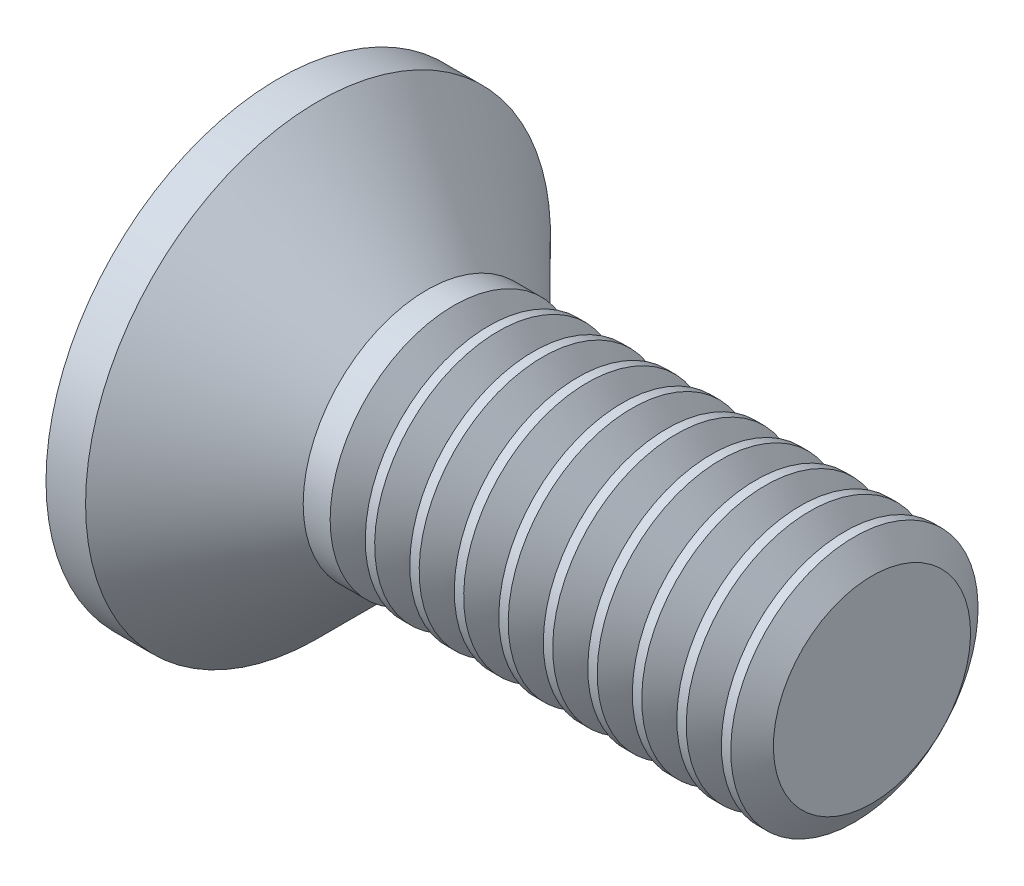
ISO-10303-21;
HEADER;
FILE_DESCRIPTION(('STEP AP214'),'2;1');
FILE_NAME('part.step','',(''),(''),'','','');
FILE_SCHEMA(('AUTOMOTIVE_DESIGN { 1 0 10303 214 1 1 1 1 }'));
ENDSEC;
DATA;
#1=APPLICATION_CONTEXT('core data for automotive mechanical design processes');
#2=APPLICATION_PROTOCOL_DEFINITION('international standard','automotive_design',2000,#1);
#3=PRODUCT_CONTEXT('',#1,'mechanical');
#4=PRODUCT('Part','Part','',(#3));
#5=PRODUCT_RELATED_PRODUCT_CATEGORY('part','',(#4));
#6=PRODUCT_DEFINITION_FORMATION('','',#4);
#7=PRODUCT_DEFINITION_CONTEXT('part definition',#1,'design');
#8=PRODUCT_DEFINITION('design','',#6,#7);
#9=PRODUCT_DEFINITION_SHAPE('','',#8);
#10=(LENGTH_UNIT() NAMED_UNIT(*) SI_UNIT(.MILLI.,.METRE.));
#11=(NAMED_UNIT(*) PLANE_ANGLE_UNIT() SI_UNIT($,.RADIAN.));
#12=(NAMED_UNIT(*) SI_UNIT($,.STERADIAN.) SOLID_ANGLE_UNIT());
#13=UNCERTAINTY_MEASURE_WITH_UNIT(LENGTH_MEASURE(1.E-05),#10,'distance_accuracy_value','');
#14=(GEOMETRIC_REPRESENTATION_CONTEXT(3) GLOBAL_UNCERTAINTY_ASSIGNED_CONTEXT((#13)) GLOBAL_UNIT_ASSIGNED_CONTEXT((#10,
#11,#12)) REPRESENTATION_CONTEXT('',''));
#15=CARTESIAN_POINT('',(0.,0.,0.));
#16=DIRECTION('',(0.,0.,1.));
#17=DIRECTION('',(1.,0.,0.));
#18=AXIS2_PLACEMENT_3D('',#15,#16,#17);
#19=CARTESIAN_POINT('',(0.,0.,0.));
#20=DIRECTION('',(-1.,0.,0.));
#21=DIRECTION('',(0.,0.,1.));
#22=AXIS2_PLACEMENT_3D('',#19,#20,#21);
#23=PLANE('',#22);
#24=CARTESIAN_POINT('',(0.,0.,0.));
#25=DIRECTION('',(-1.,0.,0.));
#26=DIRECTION('',(0.,0.,1.));
#27=AXIS2_PLACEMENT_3D('',#24,#25,#26);
#28=CIRCLE('',#27,2.35);
#29=CARTESIAN_POINT('',(0.,0.,2.35));
#30=VERTEX_POINT('',#29);
#31=EDGE_CURVE('E41',#30,#30,#28,.T.);
#32=ORIENTED_EDGE('',*,*,#31,.T.);
#33=EDGE_LOOP('',(#32));
#34=FACE_BOUND('',#33,.T.);
#35=DIRECTION('',(0.,1.,0.));
#36=VECTOR('',#35,1.);
#37=CARTESIAN_POINT('',(0.,-1.4,-0.37));
#38=LINE('',#37,#36);
#39=CARTESIAN_POINT('',(0.,-1.4,-0.37));
#40=VERTEX_POINT('',#39);
#41=CARTESIAN_POINT('',(0.,-0.369999999999999,-0.37));
#42=VERTEX_POINT('',#41);
#43=EDGE_CURVE('E102',#40,#42,#38,.T.);
#44=ORIENTED_EDGE('',*,*,#43,.T.);
#45=DIRECTION('',(0.,0.,-1.));
#46=VECTOR('',#45,1.);
#47=CARTESIAN_POINT('',(0.,-0.370000000000005,1.4));
#48=LINE('',#47,#46);
#49=CARTESIAN_POINT('',(0.,-0.369999999999995,-1.4));
#50=VERTEX_POINT('',#49);
#51=EDGE_CURVE('E82',#42,#50,#48,.T.);
#52=ORIENTED_EDGE('',*,*,#51,.T.);
#53=DIRECTION('',(0.,1.,0.));
#54=VECTOR('',#53,1.);
#55=CARTESIAN_POINT('',(0.,-0.369999999999995,-1.4));
#56=LINE('',#55,#54);
#57=CARTESIAN_POINT('',(0.,0.370000000000005,-1.4));
#58=VERTEX_POINT('',#57);
#59=EDGE_CURVE('E387',#50,#58,#56,.T.);
#60=ORIENTED_EDGE('',*,*,#59,.T.);
#61=DIRECTION('',(0.,0.,1.));
#62=VECTOR('',#61,1.);
#63=CARTESIAN_POINT('',(0.,0.370000000000005,-1.4));
#64=LINE('',#63,#62);
#65=CARTESIAN_POINT('',(0.,0.370000000000001,-0.37));
#66=VERTEX_POINT('',#65);
#67=EDGE_CURVE('E98',#58,#66,#64,.T.);
#68=ORIENTED_EDGE('',*,*,#67,.T.);
#69=CARTESIAN_POINT('',(0.,1.4,-0.37));
#70=VERTEX_POINT('',#69);
#71=EDGE_CURVE('E92',#66,#70,#38,.T.);
#72=ORIENTED_EDGE('',*,*,#71,.T.);
#73=DIRECTION('',(0.,0.,1.));
#74=VECTOR('',#73,1.);
#75=CARTESIAN_POINT('',(0.,1.4,-0.37));
#76=LINE('',#75,#74);
#77=CARTESIAN_POINT('',(0.,1.4,0.37));
#78=VERTEX_POINT('',#77);
#79=EDGE_CURVE('E95',#70,#78,#76,.T.);
#80=ORIENTED_EDGE('',*,*,#79,.T.);
#81=DIRECTION('',(0.,-1.,0.));
#82=VECTOR('',#81,1.);
#83=CARTESIAN_POINT('',(0.,1.4,0.37));
#84=LINE('',#83,#82);
#85=CARTESIAN_POINT('',(0.,0.369999999999998,0.37));
#86=VERTEX_POINT('',#85);
#87=EDGE_CURVE('E405',#78,#86,#84,.T.);
#88=ORIENTED_EDGE('',*,*,#87,.T.);
#89=CARTESIAN_POINT('',(0.,0.369999999999995,1.4));
#90=VERTEX_POINT('',#89);
#91=EDGE_CURVE('E390',#86,#90,#64,.T.);
#92=ORIENTED_EDGE('',*,*,#91,.T.);
#93=DIRECTION('',(0.,-1.,0.));
#94=VECTOR('',#93,1.);
#95=CARTESIAN_POINT('',(0.,0.369999999999995,1.4));
#96=LINE('',#95,#94);
#97=CARTESIAN_POINT('',(0.,-0.370000000000005,1.4));
#98=VERTEX_POINT('',#97);
#99=EDGE_CURVE('E381',#90,#98,#96,.T.);
#100=ORIENTED_EDGE('',*,*,#99,.T.);
#101=CARTESIAN_POINT('',(0.,-0.370000000000001,0.37));
#102=VERTEX_POINT('',#101);
#103=EDGE_CURVE('E384',#98,#102,#48,.T.);
#104=ORIENTED_EDGE('',*,*,#103,.T.);
#105=CARTESIAN_POINT('',(0.,-1.4,0.37));
#106=VERTEX_POINT('',#105);
#107=EDGE_CURVE('E108',#102,#106,#84,.T.);
#108=ORIENTED_EDGE('',*,*,#107,.T.);
#109=DIRECTION('',(0.,0.,-1.));
#110=VECTOR('',#109,1.);
#111=CARTESIAN_POINT('',(0.,-1.4,0.37));
#112=LINE('',#111,#110);
#113=EDGE_CURVE('E131',#106,#40,#112,.T.);
#114=ORIENTED_EDGE('',*,*,#113,.T.);
#115=EDGE_LOOP('',(#44,#52,#60,#68,#72,#80,#88,#92,#100,#104,#108,#114));
#116=FACE_BOUND('',#115,.T.);
#117=ADVANCED_FACE('F34',(#34,#116),#23,.T.);
#118=CARTESIAN_POINT('',(2.05102880658436,0.,0.156831275720165));
#119=DIRECTION('',(-0.103375752440195,0.,-0.994642374829981));
#120=DIRECTION('',(-0.994642374829981,0.,0.103375752440195));
#121=AXIS2_PLACEMENT_3D('',#118,#119,#120);
#122=PLANE('',#121);
#123=ORIENTED_EDGE('',*,*,#107,.F.);
#124=DIRECTION('',(0.989369949567276,0.102827775657273,-0.102827775657273));
#125=VECTOR('',#124,1.);
#126=CARTESIAN_POINT('',(2.06698399112941,-0.155173012157898,0.155173012157898));
#127=LINE('',#126,#125);
#128=CARTESIAN_POINT('',(1.78,-0.185000000000001,0.184999999999999));
#129=VERTEX_POINT('',#128);
#130=EDGE_CURVE('E126',#102,#129,#127,.T.);
#131=ORIENTED_EDGE('',*,*,#130,.T.);
#132=DIRECTION('',(0.822906402232494,0.561702965568809,-0.0855267889960739));
#133=VECTOR('',#132,1.);
#134=CARTESIAN_POINT('',(0.,-1.4,0.37));
#135=LINE('',#134,#133);
#136=EDGE_CURVE('E103',#106,#129,#135,.T.);
#137=ORIENTED_EDGE('',*,*,#136,.F.);
#138=EDGE_LOOP('',(#123,#131,#137));
#139=FACE_BOUND('',#138,.T.);
#140=ADVANCED_FACE('F151',(#139),#122,.T.);
#141=DIRECTION('',(0.822906402232494,-0.561702965568809,-0.0855267889960737));
#142=VECTOR('',#141,1.);
#143=CARTESIAN_POINT('',(0.,1.4,0.37));
#144=LINE('',#143,#142);
#145=CARTESIAN_POINT('',(1.78,0.185,0.185));
#146=VERTEX_POINT('',#145);
#147=EDGE_CURVE('E48',#78,#146,#144,.T.);
#148=ORIENTED_EDGE('',*,*,#147,.T.);
#149=DIRECTION('',(-0.989369949567276,0.102827775657273,0.102827775657273));
#150=VECTOR('',#149,1.);
#151=CARTESIAN_POINT('',(2.06698399112941,0.155173012157897,0.155173012157898));
#152=LINE('',#151,#150);
#153=EDGE_CURVE('E400',#146,#86,#152,.T.);
#154=ORIENTED_EDGE('',*,*,#153,.T.);
#155=ORIENTED_EDGE('',*,*,#87,.F.);
#156=EDGE_LOOP('',(#148,#154,#155));
#157=FACE_BOUND('',#156,.T.);
#158=ADVANCED_FACE('F155',(#157),#122,.T.);
#159=CARTESIAN_POINT('',(2.05102880658436,0.,-0.156831275720165));
#160=DIRECTION('',(-0.103375752440194,0.,0.994642374829981));
#161=DIRECTION('',(0.994642374829981,0.,0.103375752440194));
#162=AXIS2_PLACEMENT_3D('',#159,#160,#161);
#163=PLANE('',#162);
#164=DIRECTION('',(0.822906402232494,0.561702965568809,0.0855267889960737));
#165=VECTOR('',#164,1.);
#166=CARTESIAN_POINT('',(0.,-1.4,-0.37));
#167=LINE('',#166,#165);
#168=CARTESIAN_POINT('',(1.78,-0.184999999999999,-0.185000000000001));
#169=VERTEX_POINT('',#168);
#170=EDGE_CURVE('E57',#40,#169,#167,.T.);
#171=ORIENTED_EDGE('',*,*,#170,.T.);
#172=DIRECTION('',(-0.989369949567276,-0.102827775657273,-0.102827775657273));
#173=VECTOR('',#172,1.);
#174=CARTESIAN_POINT('',(2.06698399112941,-0.155173012157897,-0.155173012157898));
#175=LINE('',#174,#173);
#176=EDGE_CURVE('E11',#169,#42,#175,.T.);
#177=ORIENTED_EDGE('',*,*,#176,.T.);
#178=ORIENTED_EDGE('',*,*,#43,.F.);
#179=EDGE_LOOP('',(#171,#177,#178));
#180=FACE_BOUND('',#179,.T.);
#181=ADVANCED_FACE('F148',(#180),#163,.T.);
#182=ORIENTED_EDGE('',*,*,#71,.F.);
#183=DIRECTION('',(0.989369949567276,-0.102827775657273,0.102827775657273));
#184=VECTOR('',#183,1.);
#185=CARTESIAN_POINT('',(2.06698399112941,0.155173012157898,-0.155173012157898));
#186=LINE('',#185,#184);
#187=CARTESIAN_POINT('',(1.78,0.185,-0.185));
#188=VERTEX_POINT('',#187);
#189=EDGE_CURVE('E111',#66,#188,#186,.T.);
#190=ORIENTED_EDGE('',*,*,#189,.T.);
#191=DIRECTION('',(0.822906402232494,-0.561702965568809,0.0855267889960737));
#192=VECTOR('',#191,1.);
#193=CARTESIAN_POINT('',(0.,1.4,-0.37));
#194=LINE('',#193,#192);
#195=EDGE_CURVE('E107',#70,#188,#194,.T.);
#196=ORIENTED_EDGE('',*,*,#195,.F.);
#197=EDGE_LOOP('',(#182,#190,#196));
#198=FACE_BOUND('',#197,.T.);
#199=ADVANCED_FACE('F110',(#198),#163,.T.);
#200=CARTESIAN_POINT('',(-6.34999999999999,0.,0.));
#201=DIRECTION('',(-1.,0.,0.));
#202=DIRECTION('',(0.,0.,1.));
#203=AXIS2_PLACEMENT_3D('',#200,#201,#202);
#204=CYLINDRICAL_SURFACE('',#203,2.35);
#205=CARTESIAN_POINT('',(0.400000000000005,0.,0.));
#206=DIRECTION('',(-1.,0.,0.));
#207=DIRECTION('',(0.,0.,1.));
#208=AXIS2_PLACEMENT_3D('',#205,#206,#207);
#209=CIRCLE('',#208,2.35);
#210=CARTESIAN_POINT('',(0.400000000000005,0.,2.35));
#211=VERTEX_POINT('',#210);
#212=EDGE_CURVE('E130',#211,#211,#209,.T.);
#213=ORIENTED_EDGE('',*,*,#212,.T.);
#214=EDGE_LOOP('',(#213));
#215=FACE_BOUND('',#214,.T.);
#216=ORIENTED_EDGE('',*,*,#31,.F.);
#217=EDGE_LOOP('',(#216));
#218=FACE_BOUND('',#217,.T.);
#219=ADVANCED_FACE('F137',(#215,#218),#204,.T.);
#220=CARTESIAN_POINT('',(0.400000000000005,0.,0.));
#221=DIRECTION('',(-1.,0.,0.));
#222=DIRECTION('',(0.,0.,1.));
#223=AXIS2_PLACEMENT_3D('',#220,#221,#222);
#224=CONICAL_SURFACE('',#223,2.35,0.78539816339745);
#225=CARTESIAN_POINT('',(1.5,0.,0.));
#226=DIRECTION('',(-1.,0.,0.));
#227=DIRECTION('',(0.,0.,1.));
#228=AXIS2_PLACEMENT_3D('',#225,#226,#227);
#229=CIRCLE('',#228,1.25);
#230=CARTESIAN_POINT('',(1.5,0.,1.25));
#231=VERTEX_POINT('',#230);
#232=EDGE_CURVE('E127',#231,#231,#229,.T.);
#233=ORIENTED_EDGE('',*,*,#232,.T.);
#234=EDGE_LOOP('',(#233));
#235=FACE_BOUND('',#234,.T.);
#236=ORIENTED_EDGE('',*,*,#212,.F.);
#237=EDGE_LOOP('',(#236));
#238=FACE_BOUND('',#237,.T.);
#239=ADVANCED_FACE('F139',(#235,#238),#224,.T.);
#240=CARTESIAN_POINT('',(-6.34999999999999,0.,0.));
#241=DIRECTION('',(-1.,0.,0.));
#242=DIRECTION('',(0.,0.,1.));
#243=AXIS2_PLACEMENT_3D('',#240,#241,#242);
#244=CYLINDRICAL_SURFACE('',#243,1.25);
#245=CARTESIAN_POINT('',(1.77249838906384,0.,0.));
#246=DIRECTION('',(-1.,0.,0.));
#247=DIRECTION('',(0.,-1.,0.));
#248=AXIS2_PLACEMENT_3D('',#245,#246,#247);
#249=CIRCLE('',#248,1.25);
#250=CARTESIAN_POINT('',(1.77249838906384,-1.25,0.));
#251=VERTEX_POINT('',#250);
#252=EDGE_CURVE('E375',#251,#251,#249,.T.);
#253=ORIENTED_EDGE('',*,*,#252,.T.);
#254=EDGE_LOOP('',(#253));
#255=FACE_BOUND('',#254,.T.);
#256=ORIENTED_EDGE('',*,*,#232,.F.);
#257=EDGE_LOOP('',(#256));
#258=FACE_BOUND('',#257,.T.);
#259=ADVANCED_FACE('F145',(#255,#258),#244,.T.);
#260=CARTESIAN_POINT('',(1.78,0.185,-0.185));
#261=DIRECTION('',(1.,0.,0.));
#262=DIRECTION('',(0.,0.,-1.));
#263=AXIS2_PLACEMENT_3D('',#260,#261,#262);
#264=PLANE('',#263);
#265=DIRECTION('',(0.,1.,0.));
#266=VECTOR('',#265,1.);
#267=CARTESIAN_POINT('',(1.78,-0.185,-0.185));
#268=LINE('',#267,#266);
#269=EDGE_CURVE('E122',#169,#188,#268,.T.);
#270=ORIENTED_EDGE('',*,*,#269,.F.);
#271=DIRECTION('',(0.,0.,-1.));
#272=VECTOR('',#271,1.);
#273=CARTESIAN_POINT('',(1.78,-0.185,0.185));
#274=LINE('',#273,#272);
#275=EDGE_CURVE('E113',#129,#169,#274,.T.);
#276=ORIENTED_EDGE('',*,*,#275,.F.);
#277=DIRECTION('',(0.,-1.,0.));
#278=VECTOR('',#277,1.);
#279=CARTESIAN_POINT('',(1.78,0.185,0.185));
#280=LINE('',#279,#278);
#281=EDGE_CURVE('E116',#146,#129,#280,.T.);
#282=ORIENTED_EDGE('',*,*,#281,.F.);
#283=DIRECTION('',(0.,0.,1.));
#284=VECTOR('',#283,1.);
#285=CARTESIAN_POINT('',(1.78,0.185,-0.185));
#286=LINE('',#285,#284);
#287=EDGE_CURVE('E120',#188,#146,#286,.T.);
#288=ORIENTED_EDGE('',*,*,#287,.F.);
#289=EDGE_LOOP('',(#270,#276,#282,#288));
#290=FACE_BOUND('',#289,.T.);
#291=ADVANCED_FACE('F172',(#290),#264,.F.);
#292=CARTESIAN_POINT('',(0.,-1.4,-0.37));
#293=DIRECTION('',(-0.563768686614845,0.825932726069486,0.));
#294=DIRECTION('',(-0.825932726069486,-0.563768686614845,0.));
#295=AXIS2_PLACEMENT_3D('',#292,#293,#294);
#296=PLANE('',#295);
#297=ORIENTED_EDGE('',*,*,#170,.F.);
#298=ORIENTED_EDGE('',*,*,#113,.F.);
#299=ORIENTED_EDGE('',*,*,#136,.T.);
#300=ORIENTED_EDGE('',*,*,#275,.T.);
#301=EDGE_LOOP('',(#297,#298,#299,#300));
#302=FACE_BOUND('',#301,.T.);
#303=ADVANCED_FACE('F164',(#302),#296,.T.);
#304=CARTESIAN_POINT('',(0.,1.4,0.37));
#305=DIRECTION('',(-0.563768686614845,-0.825932726069486,0.));
#306=DIRECTION('',(0.825932726069486,-0.563768686614845,0.));
#307=AXIS2_PLACEMENT_3D('',#304,#305,#306);
#308=PLANE('',#307);
#309=ORIENTED_EDGE('',*,*,#147,.F.);
#310=ORIENTED_EDGE('',*,*,#79,.F.);
#311=ORIENTED_EDGE('',*,*,#195,.T.);
#312=ORIENTED_EDGE('',*,*,#287,.T.);
#313=EDGE_LOOP('',(#309,#310,#311,#312));
#314=FACE_BOUND('',#313,.T.);
#315=ADVANCED_FACE('F106',(#314),#308,.T.);
#316=CARTESIAN_POINT('',(2.05102880658436,-0.156831275720165,0.));
#317=DIRECTION('',(-0.103375752440195,0.994642374829981,0.));
#318=DIRECTION('',(-0.994642374829981,-0.103375752440195,0.));
#319=AXIS2_PLACEMENT_3D('',#316,#317,#318);
#320=PLANE('',#319);
#321=DIRECTION('',(0.822906402232494,0.0855267889960719,0.561702965568809));
#322=VECTOR('',#321,1.);
#323=CARTESIAN_POINT('',(0.,-0.369999999999995,-1.4));
#324=LINE('',#323,#322);
#325=EDGE_CURVE('E391',#50,#169,#324,.T.);
#326=ORIENTED_EDGE('',*,*,#325,.F.);
#327=ORIENTED_EDGE('',*,*,#51,.F.);
#328=ORIENTED_EDGE('',*,*,#176,.F.);
#329=EDGE_LOOP('',(#326,#327,#328));
#330=FACE_BOUND('',#329,.T.);
#331=ADVANCED_FACE('F171',(#330),#320,.T.);
#332=CARTESIAN_POINT('',(2.05102880658436,0.156831275720165,0.));
#333=DIRECTION('',(-0.103375752440194,-0.994642374829981,0.));
#334=DIRECTION('',(0.994642374829981,-0.103375752440194,0.));
#335=AXIS2_PLACEMENT_3D('',#332,#333,#334);
#336=PLANE('',#335);
#337=ORIENTED_EDGE('',*,*,#67,.F.);
#338=DIRECTION('',(0.822906402232494,-0.0855267889960756,0.561702965568808));
#339=VECTOR('',#338,1.);
#340=CARTESIAN_POINT('',(0.,0.370000000000005,-1.4));
#341=LINE('',#340,#339);
#342=EDGE_CURVE('E73',#58,#188,#341,.T.);
#343=ORIENTED_EDGE('',*,*,#342,.T.);
#344=ORIENTED_EDGE('',*,*,#189,.F.);
#345=EDGE_LOOP('',(#337,#343,#344));
#346=FACE_BOUND('',#345,.T.);
#347=ADVANCED_FACE('F443',(#346),#336,.T.);
#348=CARTESIAN_POINT('',(0.,0.370000000000005,-1.4));
#349=DIRECTION('',(-0.563768686614845,0.,0.825932726069486));
#350=DIRECTION('',(-0.825932726069486,0.,-0.563768686614845));
#351=AXIS2_PLACEMENT_3D('',#348,#349,#350);
#352=PLANE('',#351);
#353=ORIENTED_EDGE('',*,*,#342,.F.);
#354=ORIENTED_EDGE('',*,*,#59,.F.);
#355=ORIENTED_EDGE('',*,*,#325,.T.);
#356=ORIENTED_EDGE('',*,*,#269,.T.);
#357=EDGE_LOOP('',(#353,#354,#355,#356));
#358=FACE_BOUND('',#357,.T.);
#359=ADVANCED_FACE('F442',(#358),#352,.T.);
#360=ORIENTED_EDGE('',*,*,#103,.F.);
#361=DIRECTION('',(0.822906402232494,0.0855267889960757,-0.561702965568808));
#362=VECTOR('',#361,1.);
#363=CARTESIAN_POINT('',(0.,-0.370000000000005,1.4));
#364=LINE('',#363,#362);
#365=EDGE_CURVE('E395',#98,#129,#364,.T.);
#366=ORIENTED_EDGE('',*,*,#365,.T.);
#367=ORIENTED_EDGE('',*,*,#130,.F.);
#368=EDGE_LOOP('',(#360,#366,#367));
#369=FACE_BOUND('',#368,.T.);
#370=ADVANCED_FACE('F435',(#369),#320,.T.);
#371=DIRECTION('',(0.822906402232494,-0.0855267889960717,-0.561702965568809));
#372=VECTOR('',#371,1.);
#373=CARTESIAN_POINT('',(0.,0.369999999999995,1.4));
#374=LINE('',#373,#372);
#375=EDGE_CURVE('E380',#90,#146,#374,.T.);
#376=ORIENTED_EDGE('',*,*,#375,.F.);
#377=ORIENTED_EDGE('',*,*,#91,.F.);
#378=ORIENTED_EDGE('',*,*,#153,.F.);
#379=EDGE_LOOP('',(#376,#377,#378));
#380=FACE_BOUND('',#379,.T.);
#381=ADVANCED_FACE('F423',(#380),#336,.T.);
#382=CARTESIAN_POINT('',(0.,-0.370000000000005,1.4));
#383=DIRECTION('',(-0.563768686614845,0.,-0.825932726069486));
#384=DIRECTION('',(0.825932726069486,0.,-0.563768686614845));
#385=AXIS2_PLACEMENT_3D('',#382,#383,#384);
#386=PLANE('',#385);
#387=ORIENTED_EDGE('',*,*,#365,.F.);
#388=ORIENTED_EDGE('',*,*,#99,.F.);
#389=ORIENTED_EDGE('',*,*,#375,.T.);
#390=ORIENTED_EDGE('',*,*,#281,.T.);
#391=EDGE_LOOP('',(#387,#388,#389,#390));
#392=FACE_BOUND('',#391,.T.);
#393=ADVANCED_FACE('F429',(#392),#386,.T.);
#394=CARTESIAN_POINT('',(2.12750361093616,0.,0.));
#395=DIRECTION('',(1.,0.,0.));
#396=DIRECTION('',(0.,1.,0.));
#397=AXIS2_PLACEMENT_3D('',#394,#395,#396);
#398=CONICAL_SURFACE('',#397,1.25,0.959931088596883);
#399=CARTESIAN_POINT('',(1.950001,0.,0.));
#400=DIRECTION('',(-1.,0.,0.));
#401=DIRECTION('',(0.,-1.,0.));
#402=AXIS2_PLACEMENT_3D('',#399,#400,#401);
#403=CIRCLE('',#402,0.996500000000001);
#404=CARTESIAN_POINT('',(1.950001,-0.9965,0.));
#405=VERTEX_POINT('',#404);
#406=EDGE_CURVE('E372',#405,#405,#403,.T.);
#407=ORIENTED_EDGE('',*,*,#406,.F.);
#408=EDGE_LOOP('',(#407));
#409=FACE_BOUND('',#408,.T.);
#410=CARTESIAN_POINT('',(2.12750361093616,0.,0.));
#411=DIRECTION('',(-1.,0.,0.));
#412=DIRECTION('',(0.,-1.,0.));
#413=AXIS2_PLACEMENT_3D('',#410,#411,#412);
#414=CIRCLE('',#413,1.25);
#415=CARTESIAN_POINT('',(2.12750361093616,-1.25,0.));
#416=VERTEX_POINT('',#415);
#417=EDGE_CURVE('E377',#416,#416,#414,.T.);
#418=ORIENTED_EDGE('',*,*,#417,.T.);
#419=EDGE_LOOP('',(#418));
#420=FACE_BOUND('',#419,.T.);
#421=ADVANCED_FACE('F205',(#409,#420),#398,.T.);
#422=CARTESIAN_POINT('',(1.950001,0.,0.));
#423=DIRECTION('',(-1.,0.,0.));
#424=DIRECTION('',(0.,-1.,0.));
#425=AXIS2_PLACEMENT_3D('',#422,#423,#424);
#426=CONICAL_SURFACE('',#425,0.996500000000001,0.959931088596876);
#427=ORIENTED_EDGE('',*,*,#252,.F.);
#428=EDGE_LOOP('',(#427));
#429=FACE_BOUND('',#428,.T.);
#430=ORIENTED_EDGE('',*,*,#406,.T.);
#431=EDGE_LOOP('',(#430));
#432=FACE_BOUND('',#431,.T.);
#433=ADVANCED_FACE('F195',(#429,#432),#426,.T.);
#434=CARTESIAN_POINT('',(2.22249838906384,0.,0.));
#435=DIRECTION('',(-1.,0.,0.));
#436=DIRECTION('',(0.,-1.,0.));
#437=AXIS2_PLACEMENT_3D('',#434,#435,#436);
#438=CIRCLE('',#437,1.25);
#439=CARTESIAN_POINT('',(2.22249838906384,-1.25,0.));
#440=VERTEX_POINT('',#439);
#441=EDGE_CURVE('E367',#440,#440,#438,.T.);
#442=ORIENTED_EDGE('',*,*,#441,.T.);
#443=EDGE_LOOP('',(#442));
#444=FACE_BOUND('',#443,.T.);
#445=ORIENTED_EDGE('',*,*,#417,.F.);
#446=EDGE_LOOP('',(#445));
#447=FACE_BOUND('',#446,.T.);
#448=ADVANCED_FACE('F184',(#444,#447),#244,.T.);
#449=CARTESIAN_POINT('',(2.57750361093616,0.,0.));
#450=DIRECTION('',(1.,0.,0.));
#451=DIRECTION('',(0.,1.,0.));
#452=AXIS2_PLACEMENT_3D('',#449,#450,#451);
#453=CONICAL_SURFACE('',#452,1.25,0.959931088596883);
#454=CARTESIAN_POINT('',(2.400001,0.,0.));
#455=DIRECTION('',(-1.,0.,0.));
#456=DIRECTION('',(0.,-1.,0.));
#457=AXIS2_PLACEMENT_3D('',#454,#455,#456);
#458=CIRCLE('',#457,0.996500000000001);
#459=CARTESIAN_POINT('',(2.400001,-0.9965,0.));
#460=VERTEX_POINT('',#459);
#461=EDGE_CURVE('E364',#460,#460,#458,.T.);
#462=ORIENTED_EDGE('',*,*,#461,.F.);
#463=EDGE_LOOP('',(#462));
#464=FACE_BOUND('',#463,.T.);
#465=CARTESIAN_POINT('',(2.57750361093616,0.,0.));
#466=DIRECTION('',(-1.,0.,0.));
#467=DIRECTION('',(0.,-1.,0.));
#468=AXIS2_PLACEMENT_3D('',#465,#466,#467);
#469=CIRCLE('',#468,1.25);
#470=CARTESIAN_POINT('',(2.57750361093616,-1.25,0.));
#471=VERTEX_POINT('',#470);
#472=EDGE_CURVE('E369',#471,#471,#469,.T.);
#473=ORIENTED_EDGE('',*,*,#472,.T.);
#474=EDGE_LOOP('',(#473));
#475=FACE_BOUND('',#474,.T.);
#476=ADVANCED_FACE('F194',(#464,#475),#453,.T.);
#477=CARTESIAN_POINT('',(2.400001,0.,0.));
#478=DIRECTION('',(-1.,0.,0.));
#479=DIRECTION('',(0.,-1.,0.));
#480=AXIS2_PLACEMENT_3D('',#477,#478,#479);
#481=CONICAL_SURFACE('',#480,0.996500000000001,0.959931088596876);
#482=ORIENTED_EDGE('',*,*,#441,.F.);
#483=EDGE_LOOP('',(#482));
#484=FACE_BOUND('',#483,.T.);
#485=ORIENTED_EDGE('',*,*,#461,.T.);
#486=EDGE_LOOP('',(#485));
#487=FACE_BOUND('',#486,.T.);
#488=ADVANCED_FACE('F202',(#484,#487),#481,.T.);
#489=CARTESIAN_POINT('',(2.67249838906384,0.,0.));
#490=DIRECTION('',(-1.,0.,0.));
#491=DIRECTION('',(0.,-1.,0.));
#492=AXIS2_PLACEMENT_3D('',#489,#490,#491);
#493=CIRCLE('',#492,1.25);
#494=CARTESIAN_POINT('',(2.67249838906384,-1.25,0.));
#495=VERTEX_POINT('',#494);
#496=EDGE_CURVE('E359',#495,#495,#493,.T.);
#497=ORIENTED_EDGE('',*,*,#496,.T.);
#498=EDGE_LOOP('',(#497));
#499=FACE_BOUND('',#498,.T.);
#500=ORIENTED_EDGE('',*,*,#472,.F.);
#501=EDGE_LOOP('',(#500));
#502=FACE_BOUND('',#501,.T.);
#503=ADVANCED_FACE('F197',(#499,#502),#244,.T.);
#504=CARTESIAN_POINT('',(3.02750361093616,0.,0.));
#505=DIRECTION('',(1.,0.,0.));
#506=DIRECTION('',(0.,1.,0.));
#507=AXIS2_PLACEMENT_3D('',#504,#505,#506);
#508=CONICAL_SURFACE('',#507,1.25,0.959931088596883);
#509=CARTESIAN_POINT('',(2.850001,0.,0.));
#510=DIRECTION('',(-1.,0.,0.));
#511=DIRECTION('',(0.,-1.,0.));
#512=AXIS2_PLACEMENT_3D('',#509,#510,#511);
#513=CIRCLE('',#512,0.996500000000001);
#514=CARTESIAN_POINT('',(2.850001,-0.9965,0.));
#515=VERTEX_POINT('',#514);
#516=EDGE_CURVE('E356',#515,#515,#513,.T.);
#517=ORIENTED_EDGE('',*,*,#516,.F.);
#518=EDGE_LOOP('',(#517));
#519=FACE_BOUND('',#518,.T.);
#520=CARTESIAN_POINT('',(3.02750361093616,0.,0.));
#521=DIRECTION('',(-1.,0.,0.));
#522=DIRECTION('',(0.,-1.,0.));
#523=AXIS2_PLACEMENT_3D('',#520,#521,#522);
#524=CIRCLE('',#523,1.25);
#525=CARTESIAN_POINT('',(3.02750361093616,-1.25,0.));
#526=VERTEX_POINT('',#525);
#527=EDGE_CURVE('E361',#526,#526,#524,.T.);
#528=ORIENTED_EDGE('',*,*,#527,.T.);
#529=EDGE_LOOP('',(#528));
#530=FACE_BOUND('',#529,.T.);
#531=ADVANCED_FACE('F211',(#519,#530),#508,.T.);
#532=CARTESIAN_POINT('',(2.850001,0.,0.));
#533=DIRECTION('',(-1.,0.,0.));
#534=DIRECTION('',(0.,-1.,0.));
#535=AXIS2_PLACEMENT_3D('',#532,#533,#534);
#536=CONICAL_SURFACE('',#535,0.996500000000001,0.959931088596876);
#537=ORIENTED_EDGE('',*,*,#496,.F.);
#538=EDGE_LOOP('',(#537));
#539=FACE_BOUND('',#538,.T.);
#540=ORIENTED_EDGE('',*,*,#516,.T.);
#541=EDGE_LOOP('',(#540));
#542=FACE_BOUND('',#541,.T.);
#543=ADVANCED_FACE('F218',(#539,#542),#536,.T.);
#544=CARTESIAN_POINT('',(3.12249838906384,0.,0.));
#545=DIRECTION('',(-1.,0.,0.));
#546=DIRECTION('',(0.,-1.,0.));
#547=AXIS2_PLACEMENT_3D('',#544,#545,#546);
#548=CIRCLE('',#547,1.25);
#549=CARTESIAN_POINT('',(3.12249838906384,-1.25,0.));
#550=VERTEX_POINT('',#549);
#551=EDGE_CURVE('E351',#550,#550,#548,.T.);
#552=ORIENTED_EDGE('',*,*,#551,.T.);
#553=EDGE_LOOP('',(#552));
#554=FACE_BOUND('',#553,.T.);
#555=ORIENTED_EDGE('',*,*,#527,.F.);
#556=EDGE_LOOP('',(#555));
#557=FACE_BOUND('',#556,.T.);
#558=ADVANCED_FACE('F213',(#554,#557),#244,.T.);
#559=CARTESIAN_POINT('',(3.47750361093616,0.,0.));
#560=DIRECTION('',(1.,0.,0.));
#561=DIRECTION('',(0.,1.,0.));
#562=AXIS2_PLACEMENT_3D('',#559,#560,#561);
#563=CONICAL_SURFACE('',#562,1.25,0.959931088596883);
#564=CARTESIAN_POINT('',(3.300001,0.,0.));
#565=DIRECTION('',(-1.,0.,0.));
#566=DIRECTION('',(0.,-1.,0.));
#567=AXIS2_PLACEMENT_3D('',#564,#565,#566);
#568=CIRCLE('',#567,0.996500000000001);
#569=CARTESIAN_POINT('',(3.300001,-0.9965,0.));
#570=VERTEX_POINT('',#569);
#571=EDGE_CURVE('E348',#570,#570,#568,.T.);
#572=ORIENTED_EDGE('',*,*,#571,.F.);
#573=EDGE_LOOP('',(#572));
#574=FACE_BOUND('',#573,.T.);
#575=CARTESIAN_POINT('',(3.47750361093616,0.,0.));
#576=DIRECTION('',(-1.,0.,0.));
#577=DIRECTION('',(0.,-1.,0.));
#578=AXIS2_PLACEMENT_3D('',#575,#576,#577);
#579=CIRCLE('',#578,1.25);
#580=CARTESIAN_POINT('',(3.47750361093616,-1.25,0.));
#581=VERTEX_POINT('',#580);
#582=EDGE_CURVE('E353',#581,#581,#579,.T.);
#583=ORIENTED_EDGE('',*,*,#582,.T.);
#584=EDGE_LOOP('',(#583));
#585=FACE_BOUND('',#584,.T.);
#586=ADVANCED_FACE('F226',(#574,#585),#563,.T.);
#587=CARTESIAN_POINT('',(3.300001,0.,0.));
#588=DIRECTION('',(-1.,0.,0.));
#589=DIRECTION('',(0.,-1.,0.));
#590=AXIS2_PLACEMENT_3D('',#587,#588,#589);
#591=CONICAL_SURFACE('',#590,0.996500000000001,0.959931088596876);
#592=ORIENTED_EDGE('',*,*,#551,.F.);
#593=EDGE_LOOP('',(#592));
#594=FACE_BOUND('',#593,.T.);
#595=ORIENTED_EDGE('',*,*,#571,.T.);
#596=EDGE_LOOP('',(#595));
#597=FACE_BOUND('',#596,.T.);
#598=ADVANCED_FACE('F233',(#594,#597),#591,.T.);
#599=CARTESIAN_POINT('',(3.57249838906384,0.,0.));
#600=DIRECTION('',(-1.,0.,0.));
#601=DIRECTION('',(0.,-1.,0.));
#602=AXIS2_PLACEMENT_3D('',#599,#600,#601);
#603=CIRCLE('',#602,1.25);
#604=CARTESIAN_POINT('',(3.57249838906384,-1.25,0.));
#605=VERTEX_POINT('',#604);
#606=EDGE_CURVE('E343',#605,#605,#603,.T.);
#607=ORIENTED_EDGE('',*,*,#606,.T.);
#608=EDGE_LOOP('',(#607));
#609=FACE_BOUND('',#608,.T.);
#610=ORIENTED_EDGE('',*,*,#582,.F.);
#611=EDGE_LOOP('',(#610));
#612=FACE_BOUND('',#611,.T.);
#613=ADVANCED_FACE('F228',(#609,#612),#244,.T.);
#614=CARTESIAN_POINT('',(3.92750361093616,0.,0.));
#615=DIRECTION('',(1.,0.,0.));
#616=DIRECTION('',(0.,1.,0.));
#617=AXIS2_PLACEMENT_3D('',#614,#615,#616);
#618=CONICAL_SURFACE('',#617,1.25,0.959931088596883);
#619=CARTESIAN_POINT('',(3.750001,0.,0.));
#620=DIRECTION('',(-1.,0.,0.));
#621=DIRECTION('',(0.,-1.,0.));
#622=AXIS2_PLACEMENT_3D('',#619,#620,#621);
#623=CIRCLE('',#622,0.996500000000001);
#624=CARTESIAN_POINT('',(3.750001,-0.9965,0.));
#625=VERTEX_POINT('',#624);
#626=EDGE_CURVE('E340',#625,#625,#623,.T.);
#627=ORIENTED_EDGE('',*,*,#626,.F.);
#628=EDGE_LOOP('',(#627));
#629=FACE_BOUND('',#628,.T.);
#630=CARTESIAN_POINT('',(3.92750361093616,0.,0.));
#631=DIRECTION('',(-1.,0.,0.));
#632=DIRECTION('',(0.,-1.,0.));
#633=AXIS2_PLACEMENT_3D('',#630,#631,#632);
#634=CIRCLE('',#633,1.25);
#635=CARTESIAN_POINT('',(3.92750361093616,-1.25,0.));
#636=VERTEX_POINT('',#635);
#637=EDGE_CURVE('E345',#636,#636,#634,.T.);
#638=ORIENTED_EDGE('',*,*,#637,.T.);
#639=EDGE_LOOP('',(#638));
#640=FACE_BOUND('',#639,.T.);
#641=ADVANCED_FACE('F241',(#629,#640),#618,.T.);
#642=CARTESIAN_POINT('',(3.750001,0.,0.));
#643=DIRECTION('',(-1.,0.,0.));
#644=DIRECTION('',(0.,-1.,0.));
#645=AXIS2_PLACEMENT_3D('',#642,#643,#644);
#646=CONICAL_SURFACE('',#645,0.996500000000001,0.959931088596876);
#647=ORIENTED_EDGE('',*,*,#606,.F.);
#648=EDGE_LOOP('',(#647));
#649=FACE_BOUND('',#648,.T.);
#650=ORIENTED_EDGE('',*,*,#626,.T.);
#651=EDGE_LOOP('',(#650));
#652=FACE_BOUND('',#651,.T.);
#653=ADVANCED_FACE('F248',(#649,#652),#646,.T.);
#654=CARTESIAN_POINT('',(4.02249838906384,0.,0.));
#655=DIRECTION('',(-1.,0.,0.));
#656=DIRECTION('',(0.,-1.,0.));
#657=AXIS2_PLACEMENT_3D('',#654,#655,#656);
#658=CIRCLE('',#657,1.25);
#659=CARTESIAN_POINT('',(4.02249838906384,-1.25,0.));
#660=VERTEX_POINT('',#659);
#661=EDGE_CURVE('E335',#660,#660,#658,.T.);
#662=ORIENTED_EDGE('',*,*,#661,.T.);
#663=EDGE_LOOP('',(#662));
#664=FACE_BOUND('',#663,.T.);
#665=ORIENTED_EDGE('',*,*,#637,.F.);
#666=EDGE_LOOP('',(#665));
#667=FACE_BOUND('',#666,.T.);
#668=ADVANCED_FACE('F243',(#664,#667),#244,.T.);
#669=CARTESIAN_POINT('',(4.37750361093616,0.,0.));
#670=DIRECTION('',(1.,0.,0.));
#671=DIRECTION('',(0.,1.,0.));
#672=AXIS2_PLACEMENT_3D('',#669,#670,#671);
#673=CONICAL_SURFACE('',#672,1.25,0.959931088596883);
#674=CARTESIAN_POINT('',(4.200001,0.,0.));
#675=DIRECTION('',(-1.,0.,0.));
#676=DIRECTION('',(0.,-1.,0.));
#677=AXIS2_PLACEMENT_3D('',#674,#675,#676);
#678=CIRCLE('',#677,0.996500000000001);
#679=CARTESIAN_POINT('',(4.200001,-0.9965,0.));
#680=VERTEX_POINT('',#679);
#681=EDGE_CURVE('E332',#680,#680,#678,.T.);
#682=ORIENTED_EDGE('',*,*,#681,.F.);
#683=EDGE_LOOP('',(#682));
#684=FACE_BOUND('',#683,.T.);
#685=CARTESIAN_POINT('',(4.37750361093616,0.,0.));
#686=DIRECTION('',(-1.,0.,0.));
#687=DIRECTION('',(0.,-1.,0.));
#688=AXIS2_PLACEMENT_3D('',#685,#686,#687);
#689=CIRCLE('',#688,1.25);
#690=CARTESIAN_POINT('',(4.37750361093616,-1.25,0.));
#691=VERTEX_POINT('',#690);
#692=EDGE_CURVE('E337',#691,#691,#689,.T.);
#693=ORIENTED_EDGE('',*,*,#692,.T.);
#694=EDGE_LOOP('',(#693));
#695=FACE_BOUND('',#694,.T.);
#696=ADVANCED_FACE('F256',(#684,#695),#673,.T.);
#697=CARTESIAN_POINT('',(4.200001,0.,0.));
#698=DIRECTION('',(-1.,0.,0.));
#699=DIRECTION('',(0.,-1.,0.));
#700=AXIS2_PLACEMENT_3D('',#697,#698,#699);
#701=CONICAL_SURFACE('',#700,0.996500000000001,0.959931088596876);
#702=ORIENTED_EDGE('',*,*,#661,.F.);
#703=EDGE_LOOP('',(#702));
#704=FACE_BOUND('',#703,.T.);
#705=ORIENTED_EDGE('',*,*,#681,.T.);
#706=EDGE_LOOP('',(#705));
#707=FACE_BOUND('',#706,.T.);
#708=ADVANCED_FACE('F263',(#704,#707),#701,.T.);
#709=CARTESIAN_POINT('',(4.47249838906384,0.,0.));
#710=DIRECTION('',(-1.,0.,0.));
#711=DIRECTION('',(0.,-1.,0.));
#712=AXIS2_PLACEMENT_3D('',#709,#710,#711);
#713=CIRCLE('',#712,1.25);
#714=CARTESIAN_POINT('',(4.47249838906384,-1.25,0.));
#715=VERTEX_POINT('',#714);
#716=EDGE_CURVE('E322',#715,#715,#713,.T.);
#717=ORIENTED_EDGE('',*,*,#716,.T.);
#718=EDGE_LOOP('',(#717));
#719=FACE_BOUND('',#718,.T.);
#720=ORIENTED_EDGE('',*,*,#692,.F.);
#721=EDGE_LOOP('',(#720));
#722=FACE_BOUND('',#721,.T.);
#723=ADVANCED_FACE('F258',(#719,#722),#244,.T.);
#724=CARTESIAN_POINT('',(4.82750361093616,0.,0.));
#725=DIRECTION('',(1.,0.,0.));
#726=DIRECTION('',(0.,1.,0.));
#727=AXIS2_PLACEMENT_3D('',#724,#725,#726);
#728=CONICAL_SURFACE('',#727,1.25,0.959931088596883);
#729=CARTESIAN_POINT('',(4.650001,0.,0.));
#730=DIRECTION('',(-1.,0.,0.));
#731=DIRECTION('',(0.,-1.,0.));
#732=AXIS2_PLACEMENT_3D('',#729,#730,#731);
#733=CIRCLE('',#732,0.996500000000001);
#734=CARTESIAN_POINT('',(4.650001,-0.9965,0.));
#735=VERTEX_POINT('',#734);
#736=EDGE_CURVE('E318',#735,#735,#733,.T.);
#737=ORIENTED_EDGE('',*,*,#736,.F.);
#738=EDGE_LOOP('',(#737));
#739=FACE_BOUND('',#738,.T.);
#740=CARTESIAN_POINT('',(4.82750361093616,0.,0.));
#741=DIRECTION('',(-1.,0.,0.));
#742=DIRECTION('',(0.,-1.,0.));
#743=AXIS2_PLACEMENT_3D('',#740,#741,#742);
#744=CIRCLE('',#743,1.25);
#745=CARTESIAN_POINT('',(4.82750361093616,-1.25,0.));
#746=VERTEX_POINT('',#745);
#747=EDGE_CURVE('E329',#746,#746,#744,.T.);
#748=ORIENTED_EDGE('',*,*,#747,.T.);
#749=EDGE_LOOP('',(#748));
#750=FACE_BOUND('',#749,.T.);
#751=ADVANCED_FACE('F271',(#739,#750),#728,.T.);
#752=CARTESIAN_POINT('',(4.650001,0.,0.));
#753=DIRECTION('',(-1.,0.,0.));
#754=DIRECTION('',(0.,-1.,0.));
#755=AXIS2_PLACEMENT_3D('',#752,#753,#754);
#756=CONICAL_SURFACE('',#755,0.996500000000001,0.959931088596876);
#757=ORIENTED_EDGE('',*,*,#716,.F.);
#758=EDGE_LOOP('',(#757));
#759=FACE_BOUND('',#758,.T.);
#760=ORIENTED_EDGE('',*,*,#736,.T.);
#761=EDGE_LOOP('',(#760));
#762=FACE_BOUND('',#761,.T.);
#763=ADVANCED_FACE('F278',(#759,#762),#756,.T.);
#764=CARTESIAN_POINT('',(4.92249838906384,0.,0.));
#765=DIRECTION('',(-1.,0.,0.));
#766=DIRECTION('',(0.,-1.,0.));
#767=AXIS2_PLACEMENT_3D('',#764,#765,#766);
#768=CIRCLE('',#767,1.25);
#769=CARTESIAN_POINT('',(4.92249838906384,-1.25,0.));
#770=VERTEX_POINT('',#769);
#771=EDGE_CURVE('E319',#770,#770,#768,.T.);
#772=ORIENTED_EDGE('',*,*,#771,.T.);
#773=EDGE_LOOP('',(#772));
#774=FACE_BOUND('',#773,.T.);
#775=ORIENTED_EDGE('',*,*,#747,.F.);
#776=EDGE_LOOP('',(#775));
#777=FACE_BOUND('',#776,.T.);
#778=ADVANCED_FACE('F273',(#774,#777),#244,.T.);
#779=CARTESIAN_POINT('',(5.27750361093616,0.,0.));
#780=DIRECTION('',(1.,0.,0.));
#781=DIRECTION('',(0.,1.,0.));
#782=AXIS2_PLACEMENT_3D('',#779,#780,#781);
#783=CONICAL_SURFACE('',#782,1.25,0.959931088596883);
#784=CARTESIAN_POINT('',(5.100001,0.,0.));
#785=DIRECTION('',(-1.,0.,0.));
#786=DIRECTION('',(0.,-1.,0.));
#787=AXIS2_PLACEMENT_3D('',#784,#785,#786);
#788=CIRCLE('',#787,0.996500000000001);
#789=CARTESIAN_POINT('',(5.100001,-0.9965,0.));
#790=VERTEX_POINT('',#789);
#791=EDGE_CURVE('E324',#790,#790,#788,.T.);
#792=ORIENTED_EDGE('',*,*,#791,.F.);
#793=EDGE_LOOP('',(#792));
#794=FACE_BOUND('',#793,.T.);
#795=CARTESIAN_POINT('',(5.27750361093616,0.,0.));
#796=DIRECTION('',(-1.,0.,0.));
#797=DIRECTION('',(0.,-1.,0.));
#798=AXIS2_PLACEMENT_3D('',#795,#796,#797);
#799=CIRCLE('',#798,1.25);
#800=CARTESIAN_POINT('',(5.27750361093616,-1.25,0.));
#801=VERTEX_POINT('',#800);
#802=EDGE_CURVE('E316',#801,#801,#799,.T.);
#803=ORIENTED_EDGE('',*,*,#802,.T.);
#804=EDGE_LOOP('',(#803));
#805=FACE_BOUND('',#804,.T.);
#806=ADVANCED_FACE('F286',(#794,#805),#783,.T.);
#807=CARTESIAN_POINT('',(5.100001,0.,0.));
#808=DIRECTION('',(-1.,0.,0.));
#809=DIRECTION('',(0.,-1.,0.));
#810=AXIS2_PLACEMENT_3D('',#807,#808,#809);
#811=CONICAL_SURFACE('',#810,0.996500000000001,0.959931088596876);
#812=ORIENTED_EDGE('',*,*,#771,.F.);
#813=EDGE_LOOP('',(#812));
#814=FACE_BOUND('',#813,.T.);
#815=ORIENTED_EDGE('',*,*,#791,.T.);
#816=EDGE_LOOP('',(#815));
#817=FACE_BOUND('',#816,.T.);
#818=ADVANCED_FACE('F292',(#814,#817),#811,.T.);
#819=CARTESIAN_POINT('',(5.37249838906384,0.,0.));
#820=DIRECTION('',(-1.,0.,0.));
#821=DIRECTION('',(0.,-1.,0.));
#822=AXIS2_PLACEMENT_3D('',#819,#820,#821);
#823=CIRCLE('',#822,1.25);
#824=CARTESIAN_POINT('',(5.37249838906384,-1.25,0.));
#825=VERTEX_POINT('',#824);
#826=EDGE_CURVE('E313',#825,#825,#823,.T.);
#827=ORIENTED_EDGE('',*,*,#826,.T.);
#828=EDGE_LOOP('',(#827));
#829=FACE_BOUND('',#828,.T.);
#830=ORIENTED_EDGE('',*,*,#802,.F.);
#831=EDGE_LOOP('',(#830));
#832=FACE_BOUND('',#831,.T.);
#833=ADVANCED_FACE('F192',(#829,#832),#244,.T.);
#834=CARTESIAN_POINT('',(5.72750361093616,0.,0.));
#835=DIRECTION('',(1.,0.,0.));
#836=DIRECTION('',(0.,1.,0.));
#837=AXIS2_PLACEMENT_3D('',#834,#835,#836);
#838=CONICAL_SURFACE('',#837,1.25,0.959931088596883);
#839=CARTESIAN_POINT('',(5.550001,0.,0.));
#840=DIRECTION('',(-1.,0.,0.));
#841=DIRECTION('',(0.,-1.,0.));
#842=AXIS2_PLACEMENT_3D('',#839,#840,#841);
#843=CIRCLE('',#842,0.996500000000001);
#844=CARTESIAN_POINT('',(5.550001,-0.9965,0.));
#845=VERTEX_POINT('',#844);
#846=EDGE_CURVE('E664',#845,#845,#843,.T.);
#847=ORIENTED_EDGE('',*,*,#846,.F.);
#848=EDGE_LOOP('',(#847));
#849=FACE_BOUND('',#848,.T.);
#850=CARTESIAN_POINT('',(5.72750361093616,0.,0.));
#851=DIRECTION('',(-1.,0.,0.));
#852=DIRECTION('',(0.,-1.,0.));
#853=AXIS2_PLACEMENT_3D('',#850,#851,#852);
#854=CIRCLE('',#853,1.25);
#855=CARTESIAN_POINT('',(5.72750361093616,-1.25,0.));
#856=VERTEX_POINT('',#855);
#857=EDGE_CURVE('E670',#856,#856,#854,.T.);
#858=ORIENTED_EDGE('',*,*,#857,.T.);
#859=EDGE_LOOP('',(#858));
#860=FACE_BOUND('',#859,.T.);
#861=ADVANCED_FACE('F300',(#849,#860),#838,.T.);
#862=CARTESIAN_POINT('',(5.550001,0.,0.));
#863=DIRECTION('',(-1.,0.,0.));
#864=DIRECTION('',(0.,-1.,0.));
#865=AXIS2_PLACEMENT_3D('',#862,#863,#864);
#866=CONICAL_SURFACE('',#865,0.996500000000001,0.959931088596876);
#867=ORIENTED_EDGE('',*,*,#826,.F.);
#868=EDGE_LOOP('',(#867));
#869=FACE_BOUND('',#868,.T.);
#870=ORIENTED_EDGE('',*,*,#846,.T.);
#871=EDGE_LOOP('',(#870));
#872=FACE_BOUND('',#871,.T.);
#873=ADVANCED_FACE('F190',(#869,#872),#866,.T.);
#874=CARTESIAN_POINT('',(5.82249838906384,0.,0.));
#875=DIRECTION('',(-1.,0.,0.));
#876=DIRECTION('',(0.,-1.,0.));
#877=AXIS2_PLACEMENT_3D('',#874,#875,#876);
#878=CIRCLE('',#877,1.25);
#879=CARTESIAN_POINT('',(5.82249838906384,-1.25,0.));
#880=VERTEX_POINT('',#879);
#881=EDGE_CURVE('E659',#880,#880,#878,.T.);
#882=ORIENTED_EDGE('',*,*,#881,.T.);
#883=EDGE_LOOP('',(#882));
#884=FACE_BOUND('',#883,.T.);
#885=ORIENTED_EDGE('',*,*,#857,.F.);
#886=EDGE_LOOP('',(#885));
#887=FACE_BOUND('',#886,.T.);
#888=ADVANCED_FACE('F183',(#884,#887),#244,.T.);
#889=CARTESIAN_POINT('',(6.000001,0.,0.));
#890=DIRECTION('',(-1.,0.,0.));
#891=DIRECTION('',(0.,-1.,0.));
#892=AXIS2_PLACEMENT_3D('',#889,#890,#891);
#893=CONICAL_SURFACE('',#892,0.996500000000001,0.959931088596876);
#894=ORIENTED_EDGE('',*,*,#881,.F.);
#895=EDGE_LOOP('',(#894));
#896=FACE_BOUND('',#895,.T.);
#897=CARTESIAN_POINT('',(6.000001,0.,0.));
#898=DIRECTION('',(-1.,0.,0.));
#899=DIRECTION('',(0.,-1.,0.));
#900=AXIS2_PLACEMENT_3D('',#897,#898,#899);
#901=CIRCLE('',#900,0.996500000000001);
#902=CARTESIAN_POINT('',(6.000001,-0.9965,0.));
#903=VERTEX_POINT('',#902);
#904=EDGE_CURVE('E662',#903,#903,#901,.T.);
#905=ORIENTED_EDGE('',*,*,#904,.T.);
#906=EDGE_LOOP('',(#905));
#907=FACE_BOUND('',#906,.T.);
#908=ADVANCED_FACE('F179',(#896,#907),#893,.T.);
#909=CARTESIAN_POINT('',(6.,1.25,0.));
#910=DIRECTION('',(1.,0.,0.));
#911=DIRECTION('',(0.,0.,-1.));
#912=AXIS2_PLACEMENT_3D('',#909,#910,#911);
#913=PLANE('',#912);
#914=ORIENTED_EDGE('',*,*,#904,.F.);
#915=EDGE_LOOP('',(#914));
#916=FACE_BOUND('',#915,.T.);
#917=ADVANCED_FACE('F176',(#916),#913,.T.);
#918=CLOSED_SHELL('',(#117,#140,#158,#181,#199,#219,#239,#259,#291,#303,#315,#331,#347,#359,
#370,#381,#393,#421,#433,#448,#476,#488,#503,#531,#543,#558,#586,#598,#613,#641,#653,#668,#696,
#708,#723,#751,#763,#778,#806,#818,#833,#861,#873,#888,#908,#917));
#919=MANIFOLD_SOLID_BREP('B2',#918);
#920=ADVANCED_BREP_SHAPE_REPRESENTATION('',(#18,#919),#14);
#921=SHAPE_DEFINITION_REPRESENTATION(#9,#920);
ENDSEC;
END-ISO-10303-21;
